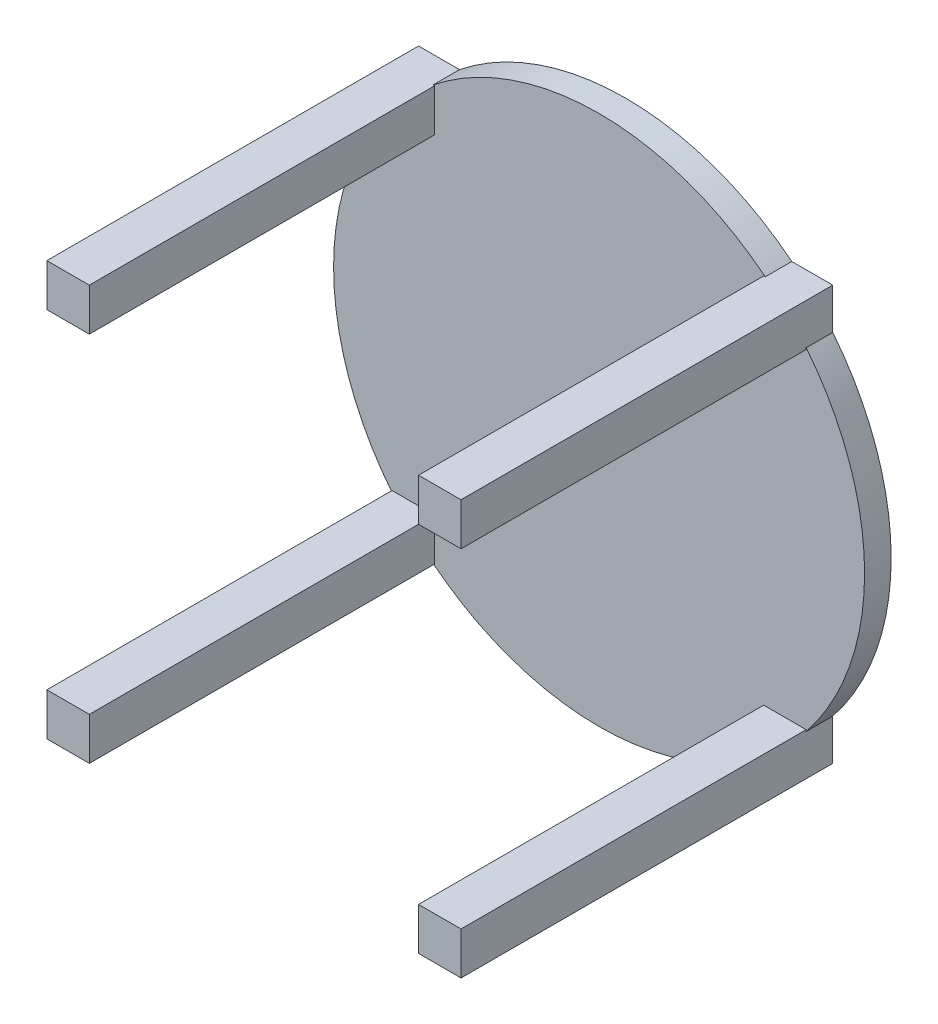
ISO-10303-21;
HEADER;
FILE_DESCRIPTION(('STEP AP214'),'2;1');
FILE_NAME('part.step','',(''),(''),'','','');
FILE_SCHEMA(('AUTOMOTIVE_DESIGN { 1 0 10303 214 1 1 1 1 }'));
ENDSEC;
DATA;
#1=APPLICATION_CONTEXT('core data for automotive mechanical design processes');
#2=APPLICATION_PROTOCOL_DEFINITION('international standard','automotive_design',2000,#1);
#3=PRODUCT_CONTEXT('',#1,'mechanical');
#4=PRODUCT('Part','Part','',(#3));
#5=PRODUCT_RELATED_PRODUCT_CATEGORY('part','',(#4));
#6=PRODUCT_DEFINITION_FORMATION('','',#4);
#7=PRODUCT_DEFINITION_CONTEXT('part definition',#1,'design');
#8=PRODUCT_DEFINITION('design','',#6,#7);
#9=PRODUCT_DEFINITION_SHAPE('','',#8);
#10=(LENGTH_UNIT() NAMED_UNIT(*) SI_UNIT(.MILLI.,.METRE.));
#11=(NAMED_UNIT(*) PLANE_ANGLE_UNIT() SI_UNIT($,.RADIAN.));
#12=(NAMED_UNIT(*) SI_UNIT($,.STERADIAN.) SOLID_ANGLE_UNIT());
#13=UNCERTAINTY_MEASURE_WITH_UNIT(LENGTH_MEASURE(1.E-05),#10,'distance_accuracy_value','');
#14=(GEOMETRIC_REPRESENTATION_CONTEXT(3) GLOBAL_UNCERTAINTY_ASSIGNED_CONTEXT((#13)) GLOBAL_UNIT_ASSIGNED_CONTEXT((#10,
#11,#12)) REPRESENTATION_CONTEXT('',''));
#15=CARTESIAN_POINT('',(0.,0.,0.));
#16=DIRECTION('',(0.,0.,1.));
#17=DIRECTION('',(1.,0.,0.));
#18=AXIS2_PLACEMENT_3D('',#15,#16,#17);
#19=CARTESIAN_POINT('',(0.,0.,50.));
#20=DIRECTION('',(0.,0.,-1.));
#21=DIRECTION('',(-1.,0.,0.));
#22=AXIS2_PLACEMENT_3D('',#19,#20,#21);
#23=CYLINDRICAL_SURFACE('',#22,500.);
#24=DIRECTION('',(0.,0.,-1.));
#25=VECTOR('',#24,1.);
#26=CARTESIAN_POINT('',(390.,-312.88975694324,50.));
#27=LINE('',#26,#25);
#28=CARTESIAN_POINT('',(390.,-312.88975694324,0.));
#29=VERTEX_POINT('',#28);
#30=CARTESIAN_POINT('',(390.,-312.88975694324,50.));
#31=VERTEX_POINT('',#30);
#32=EDGE_CURVE('E244',#29,#31,#27,.F.);
#33=ORIENTED_EDGE('',*,*,#32,.F.);
#34=CARTESIAN_POINT('',(0.,0.,0.));
#35=DIRECTION('',(0.,0.,1.));
#36=DIRECTION('',(1.,0.,0.));
#37=AXIS2_PLACEMENT_3D('',#34,#35,#36);
#38=CIRCLE('',#37,500.);
#39=CARTESIAN_POINT('',(390.,312.88975694324,0.));
#40=VERTEX_POINT('',#39);
#41=EDGE_CURVE('E365',#29,#40,#38,.T.);
#42=ORIENTED_EDGE('',*,*,#41,.T.);
#43=DIRECTION('',(0.,0.,-1.));
#44=VECTOR('',#43,1.);
#45=CARTESIAN_POINT('',(390.,312.88975694324,50.));
#46=LINE('',#45,#44);
#47=CARTESIAN_POINT('',(390.,312.88975694324,50.));
#48=VERTEX_POINT('',#47);
#49=EDGE_CURVE('E363',#48,#40,#46,.T.);
#50=ORIENTED_EDGE('',*,*,#49,.F.);
#51=CARTESIAN_POINT('',(0.,0.,50.));
#52=DIRECTION('',(0.,0.,1.));
#53=DIRECTION('',(1.,0.,0.));
#54=AXIS2_PLACEMENT_3D('',#51,#52,#53);
#55=CIRCLE('',#54,500.);
#56=EDGE_CURVE('E51',#31,#48,#55,.T.);
#57=ORIENTED_EDGE('',*,*,#56,.F.);
#58=EDGE_LOOP('',(#33,#42,#50,#57));
#59=FACE_BOUND('',#58,.T.);
#60=ADVANCED_FACE('F41',(#59),#23,.T.);
#61=DIRECTION('',(0.,0.,-1.));
#62=VECTOR('',#61,1.);
#63=CARTESIAN_POINT('',(312.88975694324,-390.,50.));
#64=LINE('',#63,#62);
#65=CARTESIAN_POINT('',(312.88975694324,-390.,50.));
#66=VERTEX_POINT('',#65);
#67=CARTESIAN_POINT('',(312.88975694324,-390.,0.));
#68=VERTEX_POINT('',#67);
#69=EDGE_CURVE('E232',#66,#68,#64,.T.);
#70=ORIENTED_EDGE('',*,*,#69,.F.);
#71=CARTESIAN_POINT('',(-312.88975694324,-390.,50.));
#72=VERTEX_POINT('',#71);
#73=EDGE_CURVE('E381',#72,#66,#55,.T.);
#74=ORIENTED_EDGE('',*,*,#73,.F.);
#75=DIRECTION('',(0.,0.,-1.));
#76=VECTOR('',#75,1.);
#77=CARTESIAN_POINT('',(-312.88975694324,-390.,50.));
#78=LINE('',#77,#76);
#79=CARTESIAN_POINT('',(-312.88975694324,-390.,0.));
#80=VERTEX_POINT('',#79);
#81=EDGE_CURVE('E66',#80,#72,#78,.F.);
#82=ORIENTED_EDGE('',*,*,#81,.F.);
#83=EDGE_CURVE('E370',#80,#68,#38,.T.);
#84=ORIENTED_EDGE('',*,*,#83,.T.);
#85=EDGE_LOOP('',(#70,#74,#82,#84));
#86=FACE_BOUND('',#85,.T.);
#87=ADVANCED_FACE('F417',(#86),#23,.T.);
#88=CARTESIAN_POINT('',(0.,0.,50.));
#89=DIRECTION('',(0.,0.,1.));
#90=DIRECTION('',(1.,0.,0.));
#91=AXIS2_PLACEMENT_3D('',#88,#89,#90);
#92=PLANE('',#91);
#93=DIRECTION('',(1.,0.,0.));
#94=VECTOR('',#93,1.);
#95=CARTESIAN_POINT('',(0.,-310.,50.));
#96=LINE('',#95,#94);
#97=CARTESIAN_POINT('',(310.,-310.,50.));
#98=VERTEX_POINT('',#97);
#99=CARTESIAN_POINT('',(390.,-310.,50.));
#100=VERTEX_POINT('',#99);
#101=EDGE_CURVE('E241',#98,#100,#96,.T.);
#102=ORIENTED_EDGE('',*,*,#101,.T.);
#103=DIRECTION('',(0.,-1.,0.));
#104=VECTOR('',#103,1.);
#105=CARTESIAN_POINT('',(390.,0.,50.));
#106=LINE('',#105,#104);
#107=EDGE_CURVE('E228',#100,#31,#106,.T.);
#108=ORIENTED_EDGE('',*,*,#107,.T.);
#109=ORIENTED_EDGE('',*,*,#56,.T.);
#110=DIRECTION('',(0.,-1.,0.));
#111=VECTOR('',#110,1.);
#112=CARTESIAN_POINT('',(390.,0.,50.));
#113=LINE('',#112,#111);
#114=CARTESIAN_POINT('',(390.,310.,50.));
#115=VERTEX_POINT('',#114);
#116=EDGE_CURVE('E360',#48,#115,#113,.T.);
#117=ORIENTED_EDGE('',*,*,#116,.T.);
#118=DIRECTION('',(-1.,0.,0.));
#119=VECTOR('',#118,1.);
#120=CARTESIAN_POINT('',(0.,310.,50.));
#121=LINE('',#120,#119);
#122=CARTESIAN_POINT('',(310.,310.,50.));
#123=VERTEX_POINT('',#122);
#124=EDGE_CURVE('E349',#115,#123,#121,.T.);
#125=ORIENTED_EDGE('',*,*,#124,.T.);
#126=DIRECTION('',(0.,1.,0.));
#127=VECTOR('',#126,1.);
#128=CARTESIAN_POINT('',(310.,0.,50.));
#129=LINE('',#128,#127);
#130=CARTESIAN_POINT('',(310.,390.,50.));
#131=VERTEX_POINT('',#130);
#132=EDGE_CURVE('E352',#123,#131,#129,.T.);
#133=ORIENTED_EDGE('',*,*,#132,.T.);
#134=DIRECTION('',(1.,0.,0.));
#135=VECTOR('',#134,1.);
#136=CARTESIAN_POINT('',(0.,390.,50.));
#137=LINE('',#136,#135);
#138=CARTESIAN_POINT('',(312.88975694324,390.,50.));
#139=VERTEX_POINT('',#138);
#140=EDGE_CURVE('E355',#131,#139,#137,.T.);
#141=ORIENTED_EDGE('',*,*,#140,.T.);
#142=CARTESIAN_POINT('',(-312.88975694324,390.,50.));
#143=VERTEX_POINT('',#142);
#144=EDGE_CURVE('E11',#139,#143,#55,.T.);
#145=ORIENTED_EDGE('',*,*,#144,.T.);
#146=DIRECTION('',(1.,0.,0.));
#147=VECTOR('',#146,1.);
#148=CARTESIAN_POINT('',(0.,390.,50.));
#149=LINE('',#148,#147);
#150=CARTESIAN_POINT('',(-310.,390.,50.));
#151=VERTEX_POINT('',#150);
#152=EDGE_CURVE('E317',#143,#151,#149,.T.);
#153=ORIENTED_EDGE('',*,*,#152,.T.);
#154=DIRECTION('',(0.,-1.,0.));
#155=VECTOR('',#154,1.);
#156=CARTESIAN_POINT('',(-310.,0.,50.));
#157=LINE('',#156,#155);
#158=CARTESIAN_POINT('',(-310.,310.,50.));
#159=VERTEX_POINT('',#158);
#160=EDGE_CURVE('E322',#151,#159,#157,.T.);
#161=ORIENTED_EDGE('',*,*,#160,.T.);
#162=DIRECTION('',(-1.,0.,0.));
#163=VECTOR('',#162,1.);
#164=CARTESIAN_POINT('',(0.,310.,50.));
#165=LINE('',#164,#163);
#166=CARTESIAN_POINT('',(-390.,310.,50.));
#167=VERTEX_POINT('',#166);
#168=EDGE_CURVE('E309',#159,#167,#165,.T.);
#169=ORIENTED_EDGE('',*,*,#168,.T.);
#170=DIRECTION('',(0.,1.,0.));
#171=VECTOR('',#170,1.);
#172=CARTESIAN_POINT('',(-390.,0.,50.));
#173=LINE('',#172,#171);
#174=CARTESIAN_POINT('',(-390.,312.88975694324,50.));
#175=VERTEX_POINT('',#174);
#176=EDGE_CURVE('E312',#167,#175,#173,.T.);
#177=ORIENTED_EDGE('',*,*,#176,.T.);
#178=CARTESIAN_POINT('',(-390.,-312.88975694324,50.));
#179=VERTEX_POINT('',#178);
#180=EDGE_CURVE('E50',#175,#179,#55,.T.);
#181=ORIENTED_EDGE('',*,*,#180,.T.);
#182=DIRECTION('',(0.,1.,0.));
#183=VECTOR('',#182,1.);
#184=CARTESIAN_POINT('',(-390.,0.,50.));
#185=LINE('',#184,#183);
#186=CARTESIAN_POINT('',(-390.,-310.,50.));
#187=VERTEX_POINT('',#186);
#188=EDGE_CURVE('E274',#179,#187,#185,.T.);
#189=ORIENTED_EDGE('',*,*,#188,.T.);
#190=DIRECTION('',(1.,0.,0.));
#191=VECTOR('',#190,1.);
#192=CARTESIAN_POINT('',(0.,-310.,50.));
#193=LINE('',#192,#191);
#194=CARTESIAN_POINT('',(-310.,-310.,50.));
#195=VERTEX_POINT('',#194);
#196=EDGE_CURVE('E279',#187,#195,#193,.T.);
#197=ORIENTED_EDGE('',*,*,#196,.T.);
#198=DIRECTION('',(0.,-1.,0.));
#199=VECTOR('',#198,1.);
#200=CARTESIAN_POINT('',(-310.,0.,50.));
#201=LINE('',#200,#199);
#202=CARTESIAN_POINT('',(-310.,-390.,50.));
#203=VERTEX_POINT('',#202);
#204=EDGE_CURVE('E282',#195,#203,#201,.T.);
#205=ORIENTED_EDGE('',*,*,#204,.T.);
#206=DIRECTION('',(-1.,0.,0.));
#207=VECTOR('',#206,1.);
#208=CARTESIAN_POINT('',(0.,-390.,50.));
#209=LINE('',#208,#207);
#210=EDGE_CURVE('E271',#203,#72,#209,.T.);
#211=ORIENTED_EDGE('',*,*,#210,.T.);
#212=ORIENTED_EDGE('',*,*,#73,.T.);
#213=DIRECTION('',(-1.,0.,0.));
#214=VECTOR('',#213,1.);
#215=CARTESIAN_POINT('',(0.,-390.,50.));
#216=LINE('',#215,#214);
#217=CARTESIAN_POINT('',(310.,-390.,50.));
#218=VERTEX_POINT('',#217);
#219=EDGE_CURVE('E229',#66,#218,#216,.T.);
#220=ORIENTED_EDGE('',*,*,#219,.T.);
#221=DIRECTION('',(0.,1.,0.));
#222=VECTOR('',#221,1.);
#223=CARTESIAN_POINT('',(310.,0.,50.));
#224=LINE('',#223,#222);
#225=EDGE_CURVE('E238',#218,#98,#224,.T.);
#226=ORIENTED_EDGE('',*,*,#225,.T.);
#227=EDGE_LOOP('',(#102,#108,#109,#117,#125,#133,#141,#145,#153,#161,#169,#177,#181,#189,#197,
#205,#211,#212,#220,#226));
#228=FACE_BOUND('',#227,.T.);
#229=ADVANCED_FACE('F411',(#228),#92,.T.);
#230=DIRECTION('',(0.,0.,-1.));
#231=VECTOR('',#230,1.);
#232=CARTESIAN_POINT('',(-390.,-312.88975694324,50.));
#233=LINE('',#232,#231);
#234=CARTESIAN_POINT('',(-390.,-312.88975694324,0.));
#235=VERTEX_POINT('',#234);
#236=EDGE_CURVE('E277',#179,#235,#233,.T.);
#237=ORIENTED_EDGE('',*,*,#236,.F.);
#238=ORIENTED_EDGE('',*,*,#180,.F.);
#239=DIRECTION('',(0.,0.,-1.));
#240=VECTOR('',#239,1.);
#241=CARTESIAN_POINT('',(-390.,312.88975694324,50.));
#242=LINE('',#241,#240);
#243=CARTESIAN_POINT('',(-390.,312.88975694324,0.));
#244=VERTEX_POINT('',#243);
#245=EDGE_CURVE('E315',#244,#175,#242,.F.);
#246=ORIENTED_EDGE('',*,*,#245,.F.);
#247=EDGE_CURVE('E375',#244,#235,#38,.T.);
#248=ORIENTED_EDGE('',*,*,#247,.T.);
#249=EDGE_LOOP('',(#237,#238,#246,#248));
#250=FACE_BOUND('',#249,.T.);
#251=ADVANCED_FACE('F387',(#250),#23,.T.);
#252=DIRECTION('',(0.,0.,-1.));
#253=VECTOR('',#252,1.);
#254=CARTESIAN_POINT('',(-312.88975694324,390.,50.));
#255=LINE('',#254,#253);
#256=CARTESIAN_POINT('',(-312.88975694324,390.,0.));
#257=VERTEX_POINT('',#256);
#258=EDGE_CURVE('E320',#143,#257,#255,.T.);
#259=ORIENTED_EDGE('',*,*,#258,.F.);
#260=ORIENTED_EDGE('',*,*,#144,.F.);
#261=DIRECTION('',(0.,0.,-1.));
#262=VECTOR('',#261,1.);
#263=CARTESIAN_POINT('',(312.88975694324,390.,50.));
#264=LINE('',#263,#262);
#265=CARTESIAN_POINT('',(312.88975694324,390.,0.));
#266=VERTEX_POINT('',#265);
#267=EDGE_CURVE('E358',#266,#139,#264,.F.);
#268=ORIENTED_EDGE('',*,*,#267,.F.);
#269=EDGE_CURVE('E45',#266,#257,#38,.T.);
#270=ORIENTED_EDGE('',*,*,#269,.T.);
#271=EDGE_LOOP('',(#259,#260,#268,#270));
#272=FACE_BOUND('',#271,.T.);
#273=ADVANCED_FACE('F43',(#272),#23,.T.);
#274=CARTESIAN_POINT('',(0.,0.,0.));
#275=DIRECTION('',(0.,0.,1.));
#276=DIRECTION('',(1.,0.,0.));
#277=AXIS2_PLACEMENT_3D('',#274,#275,#276);
#278=PLANE('',#277);
#279=ORIENTED_EDGE('',*,*,#41,.F.);
#280=DIRECTION('',(0.,1.,0.));
#281=VECTOR('',#280,1.);
#282=CARTESIAN_POINT('',(390.,-390.,0.));
#283=LINE('',#282,#281);
#284=CARTESIAN_POINT('',(390.,-390.,0.));
#285=VERTEX_POINT('',#284);
#286=EDGE_CURVE('E421',#285,#29,#283,.T.);
#287=ORIENTED_EDGE('',*,*,#286,.F.);
#288=DIRECTION('',(1.,0.,0.));
#289=VECTOR('',#288,1.);
#290=CARTESIAN_POINT('',(310.,-390.,0.));
#291=LINE('',#290,#289);
#292=EDGE_CURVE('E224',#68,#285,#291,.T.);
#293=ORIENTED_EDGE('',*,*,#292,.F.);
#294=ORIENTED_EDGE('',*,*,#83,.F.);
#295=DIRECTION('',(1.,0.,0.));
#296=VECTOR('',#295,1.);
#297=CARTESIAN_POINT('',(-390.,-390.,0.));
#298=LINE('',#297,#296);
#299=CARTESIAN_POINT('',(-390.,-390.,0.));
#300=VERTEX_POINT('',#299);
#301=EDGE_CURVE('E251',#300,#80,#298,.T.);
#302=ORIENTED_EDGE('',*,*,#301,.F.);
#303=DIRECTION('',(0.,-1.,0.));
#304=VECTOR('',#303,1.);
#305=CARTESIAN_POINT('',(-390.,-390.,0.));
#306=LINE('',#305,#304);
#307=EDGE_CURVE('E246',#235,#300,#306,.T.);
#308=ORIENTED_EDGE('',*,*,#307,.F.);
#309=ORIENTED_EDGE('',*,*,#247,.F.);
#310=DIRECTION('',(0.,-1.,0.));
#311=VECTOR('',#310,1.);
#312=CARTESIAN_POINT('',(-390.,310.,0.));
#313=LINE('',#312,#311);
#314=CARTESIAN_POINT('',(-390.,390.,0.));
#315=VERTEX_POINT('',#314);
#316=EDGE_CURVE('E290',#315,#244,#313,.T.);
#317=ORIENTED_EDGE('',*,*,#316,.F.);
#318=DIRECTION('',(-1.,0.,0.));
#319=VECTOR('',#318,1.);
#320=CARTESIAN_POINT('',(-390.,390.,0.));
#321=LINE('',#320,#319);
#322=EDGE_CURVE('E285',#257,#315,#321,.T.);
#323=ORIENTED_EDGE('',*,*,#322,.F.);
#324=ORIENTED_EDGE('',*,*,#269,.F.);
#325=DIRECTION('',(-1.,0.,0.));
#326=VECTOR('',#325,1.);
#327=CARTESIAN_POINT('',(310.,390.,0.));
#328=LINE('',#327,#326);
#329=CARTESIAN_POINT('',(390.,390.,0.));
#330=VERTEX_POINT('',#329);
#331=EDGE_CURVE('E330',#330,#266,#328,.T.);
#332=ORIENTED_EDGE('',*,*,#331,.F.);
#333=DIRECTION('',(0.,1.,0.));
#334=VECTOR('',#333,1.);
#335=CARTESIAN_POINT('',(390.,310.,0.));
#336=LINE('',#335,#334);
#337=EDGE_CURVE('E325',#40,#330,#336,.T.);
#338=ORIENTED_EDGE('',*,*,#337,.F.);
#339=EDGE_LOOP('',(#279,#287,#293,#294,#302,#308,#309,#317,#323,#324,#332,#338));
#340=FACE_BOUND('',#339,.T.);
#341=ADVANCED_FACE('F393',(#340),#278,.F.);
#342=CARTESIAN_POINT('',(390.,310.,700.));
#343=DIRECTION('',(-1.,0.,0.));
#344=DIRECTION('',(0.,0.,1.));
#345=AXIS2_PLACEMENT_3D('',#342,#343,#344);
#346=PLANE('',#345);
#347=ORIENTED_EDGE('',*,*,#116,.F.);
#348=ORIENTED_EDGE('',*,*,#49,.T.);
#349=ORIENTED_EDGE('',*,*,#337,.T.);
#350=DIRECTION('',(0.,0.,-1.));
#351=VECTOR('',#350,1.);
#352=CARTESIAN_POINT('',(390.,390.,700.));
#353=LINE('',#352,#351);
#354=CARTESIAN_POINT('',(390.,390.,700.));
#355=VERTEX_POINT('',#354);
#356=EDGE_CURVE('E346',#355,#330,#353,.T.);
#357=ORIENTED_EDGE('',*,*,#356,.F.);
#358=DIRECTION('',(0.,1.,0.));
#359=VECTOR('',#358,1.);
#360=CARTESIAN_POINT('',(390.,310.,700.));
#361=LINE('',#360,#359);
#362=CARTESIAN_POINT('',(390.,310.,700.));
#363=VERTEX_POINT('',#362);
#364=EDGE_CURVE('E326',#363,#355,#361,.T.);
#365=ORIENTED_EDGE('',*,*,#364,.F.);
#366=DIRECTION('',(0.,0.,-1.));
#367=VECTOR('',#366,1.);
#368=CARTESIAN_POINT('',(390.,310.,700.));
#369=LINE('',#368,#367);
#370=EDGE_CURVE('E336',#363,#115,#369,.T.);
#371=ORIENTED_EDGE('',*,*,#370,.T.);
#372=EDGE_LOOP('',(#347,#348,#349,#357,#365,#371));
#373=FACE_BOUND('',#372,.T.);
#374=ADVANCED_FACE('F433',(#373),#346,.F.);
#375=CARTESIAN_POINT('',(310.,390.,700.));
#376=DIRECTION('',(0.,-1.,0.));
#377=DIRECTION('',(0.,0.,-1.));
#378=AXIS2_PLACEMENT_3D('',#375,#376,#377);
#379=PLANE('',#378);
#380=ORIENTED_EDGE('',*,*,#331,.T.);
#381=ORIENTED_EDGE('',*,*,#267,.T.);
#382=ORIENTED_EDGE('',*,*,#140,.F.);
#383=DIRECTION('',(0.,0.,-1.));
#384=VECTOR('',#383,1.);
#385=CARTESIAN_POINT('',(310.,390.,700.));
#386=LINE('',#385,#384);
#387=CARTESIAN_POINT('',(310.,390.,700.));
#388=VERTEX_POINT('',#387);
#389=EDGE_CURVE('E343',#388,#131,#386,.T.);
#390=ORIENTED_EDGE('',*,*,#389,.F.);
#391=DIRECTION('',(-1.,0.,0.));
#392=VECTOR('',#391,1.);
#393=CARTESIAN_POINT('',(310.,390.,700.));
#394=LINE('',#393,#392);
#395=EDGE_CURVE('E329',#355,#388,#394,.T.);
#396=ORIENTED_EDGE('',*,*,#395,.F.);
#397=ORIENTED_EDGE('',*,*,#356,.T.);
#398=EDGE_LOOP('',(#380,#381,#382,#390,#396,#397));
#399=FACE_BOUND('',#398,.T.);
#400=ADVANCED_FACE('F436',(#399),#379,.F.);
#401=CARTESIAN_POINT('',(310.,310.,700.));
#402=DIRECTION('',(1.,0.,0.));
#403=DIRECTION('',(0.,0.,-1.));
#404=AXIS2_PLACEMENT_3D('',#401,#402,#403);
#405=PLANE('',#404);
#406=ORIENTED_EDGE('',*,*,#132,.F.);
#407=DIRECTION('',(0.,0.,-1.));
#408=VECTOR('',#407,1.);
#409=CARTESIAN_POINT('',(310.,310.,700.));
#410=LINE('',#409,#408);
#411=CARTESIAN_POINT('',(310.,310.,700.));
#412=VERTEX_POINT('',#411);
#413=EDGE_CURVE('E341',#412,#123,#410,.T.);
#414=ORIENTED_EDGE('',*,*,#413,.F.);
#415=DIRECTION('',(0.,-1.,0.));
#416=VECTOR('',#415,1.);
#417=CARTESIAN_POINT('',(310.,310.,700.));
#418=LINE('',#417,#416);
#419=EDGE_CURVE('E332',#388,#412,#418,.T.);
#420=ORIENTED_EDGE('',*,*,#419,.F.);
#421=ORIENTED_EDGE('',*,*,#389,.T.);
#422=EDGE_LOOP('',(#406,#414,#420,#421));
#423=FACE_BOUND('',#422,.T.);
#424=ADVANCED_FACE('F449',(#423),#405,.F.);
#425=CARTESIAN_POINT('',(310.,310.,700.));
#426=DIRECTION('',(0.,1.,0.));
#427=DIRECTION('',(0.,0.,1.));
#428=AXIS2_PLACEMENT_3D('',#425,#426,#427);
#429=PLANE('',#428);
#430=ORIENTED_EDGE('',*,*,#124,.F.);
#431=ORIENTED_EDGE('',*,*,#370,.F.);
#432=DIRECTION('',(1.,0.,0.));
#433=VECTOR('',#432,1.);
#434=CARTESIAN_POINT('',(310.,310.,700.));
#435=LINE('',#434,#433);
#436=EDGE_CURVE('E334',#412,#363,#435,.T.);
#437=ORIENTED_EDGE('',*,*,#436,.F.);
#438=ORIENTED_EDGE('',*,*,#413,.T.);
#439=EDGE_LOOP('',(#430,#431,#437,#438));
#440=FACE_BOUND('',#439,.T.);
#441=ADVANCED_FACE('F445',(#440),#429,.F.);
#442=CARTESIAN_POINT('',(0.,0.,700.));
#443=DIRECTION('',(0.,0.,-1.));
#444=DIRECTION('',(-1.,0.,0.));
#445=AXIS2_PLACEMENT_3D('',#442,#443,#444);
#446=PLANE('',#445);
#447=ORIENTED_EDGE('',*,*,#364,.T.);
#448=ORIENTED_EDGE('',*,*,#395,.T.);
#449=ORIENTED_EDGE('',*,*,#419,.T.);
#450=ORIENTED_EDGE('',*,*,#436,.T.);
#451=EDGE_LOOP('',(#447,#448,#449,#450));
#452=FACE_BOUND('',#451,.T.);
#453=ADVANCED_FACE('F440',(#452),#446,.F.);
#454=CARTESIAN_POINT('',(-390.,390.,700.));
#455=DIRECTION('',(0.,-1.,0.));
#456=DIRECTION('',(0.,0.,-1.));
#457=AXIS2_PLACEMENT_3D('',#454,#455,#456);
#458=PLANE('',#457);
#459=ORIENTED_EDGE('',*,*,#152,.F.);
#460=ORIENTED_EDGE('',*,*,#258,.T.);
#461=ORIENTED_EDGE('',*,*,#322,.T.);
#462=DIRECTION('',(0.,0.,-1.));
#463=VECTOR('',#462,1.);
#464=CARTESIAN_POINT('',(-390.,390.,700.));
#465=LINE('',#464,#463);
#466=CARTESIAN_POINT('',(-390.,390.,700.));
#467=VERTEX_POINT('',#466);
#468=EDGE_CURVE('E303',#467,#315,#465,.T.);
#469=ORIENTED_EDGE('',*,*,#468,.F.);
#470=DIRECTION('',(-1.,0.,0.));
#471=VECTOR('',#470,1.);
#472=CARTESIAN_POINT('',(-390.,390.,700.));
#473=LINE('',#472,#471);
#474=CARTESIAN_POINT('',(-310.,390.,700.));
#475=VERTEX_POINT('',#474);
#476=EDGE_CURVE('E289',#475,#467,#473,.T.);
#477=ORIENTED_EDGE('',*,*,#476,.F.);
#478=DIRECTION('',(0.,0.,-1.));
#479=VECTOR('',#478,1.);
#480=CARTESIAN_POINT('',(-310.,390.,700.));
#481=LINE('',#480,#479);
#482=EDGE_CURVE('E306',#475,#151,#481,.T.);
#483=ORIENTED_EDGE('',*,*,#482,.T.);
#484=EDGE_LOOP('',(#459,#460,#461,#469,#477,#483));
#485=FACE_BOUND('',#484,.T.);
#486=ADVANCED_FACE('F471',(#485),#458,.F.);
#487=CARTESIAN_POINT('',(-390.,310.,700.));
#488=DIRECTION('',(1.,0.,0.));
#489=DIRECTION('',(0.,0.,-1.));
#490=AXIS2_PLACEMENT_3D('',#487,#488,#489);
#491=PLANE('',#490);
#492=ORIENTED_EDGE('',*,*,#316,.T.);
#493=ORIENTED_EDGE('',*,*,#245,.T.);
#494=ORIENTED_EDGE('',*,*,#176,.F.);
#495=DIRECTION('',(0.,0.,-1.));
#496=VECTOR('',#495,1.);
#497=CARTESIAN_POINT('',(-390.,310.,700.));
#498=LINE('',#497,#496);
#499=CARTESIAN_POINT('',(-390.,310.,700.));
#500=VERTEX_POINT('',#499);
#501=EDGE_CURVE('E301',#500,#167,#498,.T.);
#502=ORIENTED_EDGE('',*,*,#501,.F.);
#503=DIRECTION('',(0.,-1.,0.));
#504=VECTOR('',#503,1.);
#505=CARTESIAN_POINT('',(-390.,310.,700.));
#506=LINE('',#505,#504);
#507=EDGE_CURVE('E292',#467,#500,#506,.T.);
#508=ORIENTED_EDGE('',*,*,#507,.F.);
#509=ORIENTED_EDGE('',*,*,#468,.T.);
#510=EDGE_LOOP('',(#492,#493,#494,#502,#508,#509));
#511=FACE_BOUND('',#510,.T.);
#512=ADVANCED_FACE('F484',(#511),#491,.F.);
#513=CARTESIAN_POINT('',(-310.,310.,700.));
#514=DIRECTION('',(-1.,0.,0.));
#515=DIRECTION('',(0.,0.,1.));
#516=AXIS2_PLACEMENT_3D('',#513,#514,#515);
#517=PLANE('',#516);
#518=ORIENTED_EDGE('',*,*,#160,.F.);
#519=ORIENTED_EDGE('',*,*,#482,.F.);
#520=DIRECTION('',(0.,1.,0.));
#521=VECTOR('',#520,1.);
#522=CARTESIAN_POINT('',(-310.,310.,700.));
#523=LINE('',#522,#521);
#524=CARTESIAN_POINT('',(-310.,310.,700.));
#525=VERTEX_POINT('',#524);
#526=EDGE_CURVE('E286',#525,#475,#523,.T.);
#527=ORIENTED_EDGE('',*,*,#526,.F.);
#528=DIRECTION('',(0.,0.,-1.));
#529=VECTOR('',#528,1.);
#530=CARTESIAN_POINT('',(-310.,310.,700.));
#531=LINE('',#530,#529);
#532=EDGE_CURVE('E296',#525,#159,#531,.T.);
#533=ORIENTED_EDGE('',*,*,#532,.T.);
#534=EDGE_LOOP('',(#518,#519,#527,#533));
#535=FACE_BOUND('',#534,.T.);
#536=ADVANCED_FACE('F476',(#535),#517,.F.);
#537=CARTESIAN_POINT('',(-390.,310.,700.));
#538=DIRECTION('',(0.,1.,0.));
#539=DIRECTION('',(0.,0.,1.));
#540=AXIS2_PLACEMENT_3D('',#537,#538,#539);
#541=PLANE('',#540);
#542=ORIENTED_EDGE('',*,*,#168,.F.);
#543=ORIENTED_EDGE('',*,*,#532,.F.);
#544=DIRECTION('',(1.,0.,0.));
#545=VECTOR('',#544,1.);
#546=CARTESIAN_POINT('',(-390.,310.,700.));
#547=LINE('',#546,#545);
#548=EDGE_CURVE('E294',#500,#525,#547,.T.);
#549=ORIENTED_EDGE('',*,*,#548,.F.);
#550=ORIENTED_EDGE('',*,*,#501,.T.);
#551=EDGE_LOOP('',(#542,#543,#549,#550));
#552=FACE_BOUND('',#551,.T.);
#553=ADVANCED_FACE('F480',(#552),#541,.F.);
#554=CARTESIAN_POINT('',(0.,0.,700.));
#555=DIRECTION('',(0.,0.,-1.));
#556=DIRECTION('',(-1.,0.,0.));
#557=AXIS2_PLACEMENT_3D('',#554,#555,#556);
#558=PLANE('',#557);
#559=ORIENTED_EDGE('',*,*,#526,.T.);
#560=ORIENTED_EDGE('',*,*,#476,.T.);
#561=ORIENTED_EDGE('',*,*,#507,.T.);
#562=ORIENTED_EDGE('',*,*,#548,.T.);
#563=EDGE_LOOP('',(#559,#560,#561,#562));
#564=FACE_BOUND('',#563,.T.);
#565=ADVANCED_FACE('F486',(#564),#558,.F.);
#566=CARTESIAN_POINT('',(-390.,-390.,700.));
#567=DIRECTION('',(1.,0.,0.));
#568=DIRECTION('',(0.,0.,-1.));
#569=AXIS2_PLACEMENT_3D('',#566,#567,#568);
#570=PLANE('',#569);
#571=ORIENTED_EDGE('',*,*,#188,.F.);
#572=ORIENTED_EDGE('',*,*,#236,.T.);
#573=ORIENTED_EDGE('',*,*,#307,.T.);
#574=DIRECTION('',(0.,0.,-1.));
#575=VECTOR('',#574,1.);
#576=CARTESIAN_POINT('',(-390.,-390.,700.));
#577=LINE('',#576,#575);
#578=CARTESIAN_POINT('',(-390.,-390.,700.));
#579=VERTEX_POINT('',#578);
#580=EDGE_CURVE('E262',#579,#300,#577,.T.);
#581=ORIENTED_EDGE('',*,*,#580,.F.);
#582=DIRECTION('',(0.,-1.,0.));
#583=VECTOR('',#582,1.);
#584=CARTESIAN_POINT('',(-390.,-390.,700.));
#585=LINE('',#584,#583);
#586=CARTESIAN_POINT('',(-390.,-310.,700.));
#587=VERTEX_POINT('',#586);
#588=EDGE_CURVE('E253',#587,#579,#585,.T.);
#589=ORIENTED_EDGE('',*,*,#588,.F.);
#590=DIRECTION('',(0.,0.,-1.));
#591=VECTOR('',#590,1.);
#592=CARTESIAN_POINT('',(-390.,-310.,700.));
#593=LINE('',#592,#591);
#594=EDGE_CURVE('E265',#587,#187,#593,.T.);
#595=ORIENTED_EDGE('',*,*,#594,.T.);
#596=EDGE_LOOP('',(#571,#572,#573,#581,#589,#595));
#597=FACE_BOUND('',#596,.T.);
#598=ADVANCED_FACE('F399',(#597),#570,.F.);
#599=CARTESIAN_POINT('',(-390.,-390.,700.));
#600=DIRECTION('',(0.,1.,0.));
#601=DIRECTION('',(0.,0.,1.));
#602=AXIS2_PLACEMENT_3D('',#599,#600,#601);
#603=PLANE('',#602);
#604=ORIENTED_EDGE('',*,*,#301,.T.);
#605=ORIENTED_EDGE('',*,*,#81,.T.);
#606=ORIENTED_EDGE('',*,*,#210,.F.);
#607=DIRECTION('',(0.,0.,-1.));
#608=VECTOR('',#607,1.);
#609=CARTESIAN_POINT('',(-310.,-390.,700.));
#610=LINE('',#609,#608);
#611=CARTESIAN_POINT('',(-310.,-390.,700.));
#612=VERTEX_POINT('',#611);
#613=EDGE_CURVE('E257',#612,#203,#610,.T.);
#614=ORIENTED_EDGE('',*,*,#613,.F.);
#615=DIRECTION('',(1.,0.,0.));
#616=VECTOR('',#615,1.);
#617=CARTESIAN_POINT('',(-390.,-390.,700.));
#618=LINE('',#617,#616);
#619=EDGE_CURVE('E255',#579,#612,#618,.T.);
#620=ORIENTED_EDGE('',*,*,#619,.F.);
#621=ORIENTED_EDGE('',*,*,#580,.T.);
#622=EDGE_LOOP('',(#604,#605,#606,#614,#620,#621));
#623=FACE_BOUND('',#622,.T.);
#624=ADVANCED_FACE('F402',(#623),#603,.F.);
#625=CARTESIAN_POINT('',(-310.,-390.,700.));
#626=DIRECTION('',(-1.,0.,0.));
#627=DIRECTION('',(0.,0.,1.));
#628=AXIS2_PLACEMENT_3D('',#625,#626,#627);
#629=PLANE('',#628);
#630=ORIENTED_EDGE('',*,*,#204,.F.);
#631=DIRECTION('',(0.,0.,-1.));
#632=VECTOR('',#631,1.);
#633=CARTESIAN_POINT('',(-310.,-310.,700.));
#634=LINE('',#633,#632);
#635=CARTESIAN_POINT('',(-310.,-310.,700.));
#636=VERTEX_POINT('',#635);
#637=EDGE_CURVE('E268',#636,#195,#634,.T.);
#638=ORIENTED_EDGE('',*,*,#637,.F.);
#639=DIRECTION('',(0.,1.,0.));
#640=VECTOR('',#639,1.);
#641=CARTESIAN_POINT('',(-310.,-390.,700.));
#642=LINE('',#641,#640);
#643=EDGE_CURVE('E247',#612,#636,#642,.T.);
#644=ORIENTED_EDGE('',*,*,#643,.F.);
#645=ORIENTED_EDGE('',*,*,#613,.T.);
#646=EDGE_LOOP('',(#630,#638,#644,#645));
#647=FACE_BOUND('',#646,.T.);
#648=ADVANCED_FACE('F496',(#647),#629,.F.);
#649=CARTESIAN_POINT('',(-390.,-310.,700.));
#650=DIRECTION('',(0.,-1.,0.));
#651=DIRECTION('',(0.,0.,-1.));
#652=AXIS2_PLACEMENT_3D('',#649,#650,#651);
#653=PLANE('',#652);
#654=ORIENTED_EDGE('',*,*,#196,.F.);
#655=ORIENTED_EDGE('',*,*,#594,.F.);
#656=DIRECTION('',(-1.,0.,0.));
#657=VECTOR('',#656,1.);
#658=CARTESIAN_POINT('',(-390.,-310.,700.));
#659=LINE('',#658,#657);
#660=EDGE_CURVE('E250',#636,#587,#659,.T.);
#661=ORIENTED_EDGE('',*,*,#660,.F.);
#662=ORIENTED_EDGE('',*,*,#637,.T.);
#663=EDGE_LOOP('',(#654,#655,#661,#662));
#664=FACE_BOUND('',#663,.T.);
#665=ADVANCED_FACE('F601',(#664),#653,.F.);
#666=CARTESIAN_POINT('',(0.,0.,700.));
#667=DIRECTION('',(0.,0.,-1.));
#668=DIRECTION('',(-1.,0.,0.));
#669=AXIS2_PLACEMENT_3D('',#666,#667,#668);
#670=PLANE('',#669);
#671=ORIENTED_EDGE('',*,*,#643,.T.);
#672=ORIENTED_EDGE('',*,*,#660,.T.);
#673=ORIENTED_EDGE('',*,*,#588,.T.);
#674=ORIENTED_EDGE('',*,*,#619,.T.);
#675=EDGE_LOOP('',(#671,#672,#673,#674));
#676=FACE_BOUND('',#675,.T.);
#677=ADVANCED_FACE('F406',(#676),#670,.F.);
#678=CARTESIAN_POINT('',(390.,-390.,700.));
#679=DIRECTION('',(-1.,0.,0.));
#680=DIRECTION('',(0.,0.,1.));
#681=AXIS2_PLACEMENT_3D('',#678,#679,#680);
#682=PLANE('',#681);
#683=ORIENTED_EDGE('',*,*,#286,.T.);
#684=ORIENTED_EDGE('',*,*,#32,.T.);
#685=ORIENTED_EDGE('',*,*,#107,.F.);
#686=DIRECTION('',(0.,0.,-1.));
#687=VECTOR('',#686,1.);
#688=CARTESIAN_POINT('',(390.,-310.,700.));
#689=LINE('',#688,#687);
#690=CARTESIAN_POINT('',(390.,-310.,700.));
#691=VERTEX_POINT('',#690);
#692=EDGE_CURVE('E209',#691,#100,#689,.T.);
#693=ORIENTED_EDGE('',*,*,#692,.F.);
#694=DIRECTION('',(0.,1.,0.));
#695=VECTOR('',#694,1.);
#696=CARTESIAN_POINT('',(390.,-390.,700.));
#697=LINE('',#696,#695);
#698=CARTESIAN_POINT('',(390.,-390.,700.));
#699=VERTEX_POINT('',#698);
#700=EDGE_CURVE('E216',#699,#691,#697,.T.);
#701=ORIENTED_EDGE('',*,*,#700,.F.);
#702=DIRECTION('',(0.,0.,-1.));
#703=VECTOR('',#702,1.);
#704=CARTESIAN_POINT('',(390.,-390.,700.));
#705=LINE('',#704,#703);
#706=EDGE_CURVE('E426',#699,#285,#705,.T.);
#707=ORIENTED_EDGE('',*,*,#706,.T.);
#708=EDGE_LOOP('',(#683,#684,#685,#693,#701,#707));
#709=FACE_BOUND('',#708,.T.);
#710=ADVANCED_FACE('F226',(#709),#682,.F.);
#711=CARTESIAN_POINT('',(310.,-390.,700.));
#712=DIRECTION('',(0.,1.,0.));
#713=DIRECTION('',(0.,0.,1.));
#714=AXIS2_PLACEMENT_3D('',#711,#712,#713);
#715=PLANE('',#714);
#716=ORIENTED_EDGE('',*,*,#219,.F.);
#717=ORIENTED_EDGE('',*,*,#69,.T.);
#718=ORIENTED_EDGE('',*,*,#292,.T.);
#719=ORIENTED_EDGE('',*,*,#706,.F.);
#720=DIRECTION('',(1.,0.,0.));
#721=VECTOR('',#720,1.);
#722=CARTESIAN_POINT('',(310.,-390.,700.));
#723=LINE('',#722,#721);
#724=CARTESIAN_POINT('',(310.,-390.,700.));
#725=VERTEX_POINT('',#724);
#726=EDGE_CURVE('E220',#725,#699,#723,.T.);
#727=ORIENTED_EDGE('',*,*,#726,.F.);
#728=DIRECTION('',(0.,0.,-1.));
#729=VECTOR('',#728,1.);
#730=CARTESIAN_POINT('',(310.,-390.,700.));
#731=LINE('',#730,#729);
#732=EDGE_CURVE('E58',#725,#218,#731,.T.);
#733=ORIENTED_EDGE('',*,*,#732,.T.);
#734=EDGE_LOOP('',(#716,#717,#718,#719,#727,#733));
#735=FACE_BOUND('',#734,.T.);
#736=ADVANCED_FACE('F419',(#735),#715,.F.);
#737=CARTESIAN_POINT('',(310.,-310.,700.));
#738=DIRECTION('',(0.,-1.,0.));
#739=DIRECTION('',(0.,0.,-1.));
#740=AXIS2_PLACEMENT_3D('',#737,#738,#739);
#741=PLANE('',#740);
#742=ORIENTED_EDGE('',*,*,#101,.F.);
#743=DIRECTION('',(0.,0.,-1.));
#744=VECTOR('',#743,1.);
#745=CARTESIAN_POINT('',(310.,-310.,700.));
#746=LINE('',#745,#744);
#747=CARTESIAN_POINT('',(310.,-310.,700.));
#748=VERTEX_POINT('',#747);
#749=EDGE_CURVE('E212',#748,#98,#746,.T.);
#750=ORIENTED_EDGE('',*,*,#749,.F.);
#751=DIRECTION('',(-1.,0.,0.));
#752=VECTOR('',#751,1.);
#753=CARTESIAN_POINT('',(310.,-310.,700.));
#754=LINE('',#753,#752);
#755=EDGE_CURVE('E205',#691,#748,#754,.T.);
#756=ORIENTED_EDGE('',*,*,#755,.F.);
#757=ORIENTED_EDGE('',*,*,#692,.T.);
#758=EDGE_LOOP('',(#742,#750,#756,#757));
#759=FACE_BOUND('',#758,.T.);
#760=ADVANCED_FACE('F207',(#759),#741,.F.);
#761=CARTESIAN_POINT('',(310.,-390.,700.));
#762=DIRECTION('',(1.,0.,0.));
#763=DIRECTION('',(0.,0.,-1.));
#764=AXIS2_PLACEMENT_3D('',#761,#762,#763);
#765=PLANE('',#764);
#766=ORIENTED_EDGE('',*,*,#225,.F.);
#767=ORIENTED_EDGE('',*,*,#732,.F.);
#768=DIRECTION('',(0.,-1.,0.));
#769=VECTOR('',#768,1.);
#770=CARTESIAN_POINT('',(310.,-390.,700.));
#771=LINE('',#770,#769);
#772=EDGE_CURVE('E215',#748,#725,#771,.T.);
#773=ORIENTED_EDGE('',*,*,#772,.F.);
#774=ORIENTED_EDGE('',*,*,#749,.T.);
#775=EDGE_LOOP('',(#766,#767,#773,#774));
#776=FACE_BOUND('',#775,.T.);
#777=ADVANCED_FACE('F429',(#776),#765,.F.);
#778=CARTESIAN_POINT('',(0.,0.,700.));
#779=DIRECTION('',(0.,0.,-1.));
#780=DIRECTION('',(-1.,0.,0.));
#781=AXIS2_PLACEMENT_3D('',#778,#779,#780);
#782=PLANE('',#781);
#783=ORIENTED_EDGE('',*,*,#700,.T.);
#784=ORIENTED_EDGE('',*,*,#755,.T.);
#785=ORIENTED_EDGE('',*,*,#772,.T.);
#786=ORIENTED_EDGE('',*,*,#726,.T.);
#787=EDGE_LOOP('',(#783,#784,#785,#786));
#788=FACE_BOUND('',#787,.T.);
#789=ADVANCED_FACE('F219',(#788),#782,.F.);
#790=CLOSED_SHELL('',(#60,#87,#229,#251,#273,#341,#374,#400,#424,#441,#453,#486,#512,#536,#553,
#565,#598,#624,#648,#665,#677,#710,#736,#760,#777,#789));
#791=MANIFOLD_SOLID_BREP('B2',#790);
#792=ADVANCED_BREP_SHAPE_REPRESENTATION('',(#18,#791),#14);
#793=SHAPE_DEFINITION_REPRESENTATION(#9,#792);
ENDSEC;
END-ISO-10303-21;
